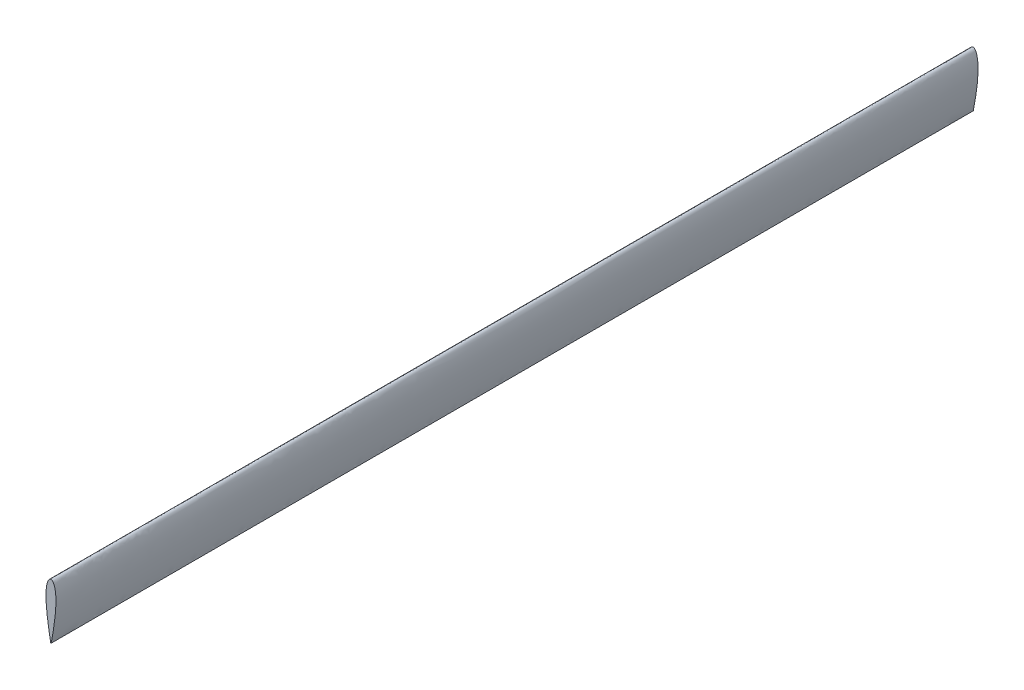
ISO-10303-21;
HEADER;
FILE_DESCRIPTION(('STEP AP214'),'2;1');
FILE_NAME('part.step','',(''),(''),'','','');
FILE_SCHEMA(('AUTOMOTIVE_DESIGN { 1 0 10303 214 1 1 1 1 }'));
ENDSEC;
DATA;
#1=APPLICATION_CONTEXT('core data for automotive mechanical design processes');
#2=APPLICATION_PROTOCOL_DEFINITION('international standard','automotive_design',2000,#1);
#3=PRODUCT_CONTEXT('',#1,'mechanical');
#4=PRODUCT('Part','Part','',(#3));
#5=PRODUCT_RELATED_PRODUCT_CATEGORY('part','',(#4));
#6=PRODUCT_DEFINITION_FORMATION('','',#4);
#7=PRODUCT_DEFINITION_CONTEXT('part definition',#1,'design');
#8=PRODUCT_DEFINITION('design','',#6,#7);
#9=PRODUCT_DEFINITION_SHAPE('','',#8);
#10=(LENGTH_UNIT() NAMED_UNIT(*) SI_UNIT(.MILLI.,.METRE.));
#11=(NAMED_UNIT(*) PLANE_ANGLE_UNIT() SI_UNIT($,.RADIAN.));
#12=(NAMED_UNIT(*) SI_UNIT($,.STERADIAN.) SOLID_ANGLE_UNIT());
#13=UNCERTAINTY_MEASURE_WITH_UNIT(LENGTH_MEASURE(1.E-05),#10,'distance_accuracy_value','');
#14=(GEOMETRIC_REPRESENTATION_CONTEXT(3) GLOBAL_UNCERTAINTY_ASSIGNED_CONTEXT((#13)) GLOBAL_UNIT_ASSIGNED_CONTEXT((#10,
#11,#12)) REPRESENTATION_CONTEXT('',''));
#15=CARTESIAN_POINT('',(0.,0.,0.));
#16=DIRECTION('',(0.,0.,1.));
#17=DIRECTION('',(1.,0.,0.));
#18=AXIS2_PLACEMENT_3D('',#15,#16,#17);
#19=CARTESIAN_POINT('',(-67.4875948517575,-64.5353199929207,500.));
#20=CARTESIAN_POINT('',(-67.7913401335257,-64.5353199924537,500.));
#21=CARTESIAN_POINT('',(-68.3959590638923,-64.8534442465416,500.));
#22=CARTESIAN_POINT('',(-68.9508504087496,-65.6908851901135,500.));
#23=CARTESIAN_POINT('',(-69.4058058106419,-66.7768010889075,500.));
#24=CARTESIAN_POINT('',(-69.7610601050504,-68.1643576571227,500.));
#25=CARTESIAN_POINT('',(-70.0166462813643,-69.8246972827324,500.));
#26=CARTESIAN_POINT('',(-70.1631606961197,-71.7202966596855,500.));
#27=CARTESIAN_POINT('',(-70.1985244608073,-73.8055787115878,500.));
#28=CARTESIAN_POINT('',(-70.1328091092104,-76.0297354682546,500.));
#29=CARTESIAN_POINT('',(-69.9786088417882,-78.3384638931205,500.));
#30=CARTESIAN_POINT('',(-69.7555180676215,-80.67535013921,500.));
#31=CARTESIAN_POINT('',(-69.4825776714293,-82.9831954272819,500.));
#32=CARTESIAN_POINT('',(-69.1801203259965,-85.2052312074084,500.));
#33=CARTESIAN_POINT('',(-68.8646216730773,-87.2877298405176,500.));
#34=CARTESIAN_POINT('',(-68.5501470662488,-89.1754220646044,500.));
#35=CARTESIAN_POINT('',(-68.2669138523294,-90.8352939267604,500.));
#36=CARTESIAN_POINT('',(-67.9857382943077,-92.1866330612374,500.));
#37=CARTESIAN_POINT('',(-67.8344656475918,-93.3019540823841,500.));
#38=CARTESIAN_POINT('',(-67.5667925256463,-93.9084000357001,500.));
#39=CARTESIAN_POINT('',(-67.6647805929366,-94.4852670665843,500.));
#40=CARTESIAN_POINT('',(-67.3104078582983,-94.4852677320834,500.));
#41=CARTESIAN_POINT('',(-67.408454431838,-93.9083903516476,500.));
#42=CARTESIAN_POINT('',(-67.1401902805008,-93.3020411982596,500.));
#43=CARTESIAN_POINT('',(-66.992796390824,-92.1860882095502,500.));
#44=CARTESIAN_POINT('',(-66.6905040117802,-90.8381458734179,500.));
#45=CARTESIAN_POINT('',(-66.5103263391537,-89.1612818905882,500.));
#46=CARTESIAN_POINT('',(-66.0523240559354,-87.2970608255184,500.));
#47=CARTESIAN_POINT('',(-65.946486905602,-85.1840526893623,500.));
#48=CARTESIAN_POINT('',(-65.4495105880155,-82.9906611684524,500.));
#49=CARTESIAN_POINT('',(-65.2315561965908,-80.6735608608053,500.));
#50=CARTESIAN_POINT('',(-64.9934301778194,-78.3389382439019,500.));
#51=CARTESIAN_POINT('',(-64.8431854166046,-76.0296142983408,500.));
#52=CARTESIAN_POINT('',(-64.7764674101248,-73.8056084962441,500.));
#53=CARTESIAN_POINT('',(-64.8120756660437,-71.7202896349983,500.));
#54=CARTESIAN_POINT('',(-64.9585329179068,-69.8246988641866,500.));
#55=CARTESIAN_POINT('',(-65.2141318380491,-68.1643573199626,500.));
#56=CARTESIAN_POINT('',(-65.5693834455864,-66.7768011561874,500.));
#57=CARTESIAN_POINT('',(-66.0243393781533,-65.690885177718,500.));
#58=CARTESIAN_POINT('',(-66.5792306180997,-64.8534442493416,500.));
#59=CARTESIAN_POINT('',(-67.1838495699839,-64.5353199933878,500.));
#60=CARTESIAN_POINT('',(-67.4875948517575,-64.5353199929207,500.));
#61=B_SPLINE_CURVE_WITH_KNOTS('',3,(#19,#20,#21,#22,#23,#24,#25,#26,#27,#28,#29,#30,#31,#32,#33,
#34,#35,#36,#37,#38,#39,#40,#41,#42,#43,#44,#45,#46,#47,#48,#49,#50,#51,#52,#53,#54,#55,#56,#57,
#58,#59,#60),.UNSPECIFIED.,.T.,.F.,(4,1,1,1,1,1,1,1,1,1,1,1,1,1,1,1,1,1,1,1,1,1,1,1,1,1,1,1,1,1,
1,1,1,1,1,1,1,1,1,4),(0.,0.0148086182017369,0.029477235019192,0.0482263545479257,
0.0712801299397421,0.0984042349789458,0.129148048090653,0.162903353778195,0.198940155927656,
0.236430123061365,0.274475786691061,0.312143718610114,0.348497571744518,0.38263195008991,
0.413688920929307,0.440887576679614,0.463541539146755,0.48106581718318,0.493013516153424,
0.499065386583345,0.500894221436263,0.506946091866184,0.518893790836485,0.536418068872882,
0.559072031339997,0.586272735336263,0.617337469967529,0.651455834386372,0.687856281389712,
0.725524213308781,0.763569876938464,0.801059844072182,0.837096646221639,0.870851951909178,
0.901595765020885,0.928719870060112,0.951773645451928,0.970522764980719,0.985191381798002,1.),.UNSPECIFIED.);
#62=DIRECTION('',(0.,0.,-1.));
#63=VECTOR('',#62,1.);
#64=SURFACE_OF_LINEAR_EXTRUSION('',#61,#63);
#65=CARTESIAN_POINT('',(-67.4875948517575,-64.5353199929207,500.));
#66=VERTEX_POINT('',#65);
#67=EDGE_CURVE('E10',#66,#66,#61,.T.);
#68=ORIENTED_EDGE('',*,*,#67,.F.);
#69=EDGE_LOOP('',(#68));
#70=FACE_BOUND('',#69,.T.);
#71=CARTESIAN_POINT('',(-67.4875948517575,-64.5353199929207,0.));
#72=CARTESIAN_POINT('',(-67.7913401335257,-64.5353199924537,0.));
#73=CARTESIAN_POINT('',(-68.3959590638923,-64.8534442465416,0.));
#74=CARTESIAN_POINT('',(-68.9508504087496,-65.6908851901135,0.));
#75=CARTESIAN_POINT('',(-69.4058058106419,-66.7768010889075,0.));
#76=CARTESIAN_POINT('',(-69.7610601050504,-68.1643576571227,0.));
#77=CARTESIAN_POINT('',(-70.0166462813643,-69.8246972827324,0.));
#78=CARTESIAN_POINT('',(-70.1631606961197,-71.7202966596855,0.));
#79=CARTESIAN_POINT('',(-70.1985244608073,-73.8055787115878,0.));
#80=CARTESIAN_POINT('',(-70.1328091092104,-76.0297354682546,0.));
#81=CARTESIAN_POINT('',(-69.9786088417882,-78.3384638931205,0.));
#82=CARTESIAN_POINT('',(-69.7555180676215,-80.67535013921,0.));
#83=CARTESIAN_POINT('',(-69.4825776714293,-82.9831954272819,0.));
#84=CARTESIAN_POINT('',(-69.1801203259965,-85.2052312074084,0.));
#85=CARTESIAN_POINT('',(-68.8646216730773,-87.2877298405176,0.));
#86=CARTESIAN_POINT('',(-68.5501470662488,-89.1754220646044,0.));
#87=CARTESIAN_POINT('',(-68.2669138523294,-90.8352939267604,0.));
#88=CARTESIAN_POINT('',(-67.9857382943077,-92.1866330612374,0.));
#89=CARTESIAN_POINT('',(-67.8344656475918,-93.3019540823841,0.));
#90=CARTESIAN_POINT('',(-67.5667925256463,-93.9084000357001,0.));
#91=CARTESIAN_POINT('',(-67.6647805929366,-94.4852670665843,0.));
#92=CARTESIAN_POINT('',(-67.3104078582983,-94.4852677320834,0.));
#93=CARTESIAN_POINT('',(-67.408454431838,-93.9083903516476,0.));
#94=CARTESIAN_POINT('',(-67.1401902805008,-93.3020411982596,0.));
#95=CARTESIAN_POINT('',(-66.992796390824,-92.1860882095502,0.));
#96=CARTESIAN_POINT('',(-66.6905040117802,-90.8381458734179,0.));
#97=CARTESIAN_POINT('',(-66.5103263391537,-89.1612818905882,0.));
#98=CARTESIAN_POINT('',(-66.0523240559354,-87.2970608255184,0.));
#99=CARTESIAN_POINT('',(-65.946486905602,-85.1840526893623,0.));
#100=CARTESIAN_POINT('',(-65.4495105880155,-82.9906611684524,0.));
#101=CARTESIAN_POINT('',(-65.2315561965908,-80.6735608608053,0.));
#102=CARTESIAN_POINT('',(-64.9934301778194,-78.3389382439019,0.));
#103=CARTESIAN_POINT('',(-64.8431854166046,-76.0296142983408,0.));
#104=CARTESIAN_POINT('',(-64.7764674101248,-73.8056084962441,0.));
#105=CARTESIAN_POINT('',(-64.8120756660437,-71.7202896349983,0.));
#106=CARTESIAN_POINT('',(-64.9585329179068,-69.8246988641866,0.));
#107=CARTESIAN_POINT('',(-65.2141318380491,-68.1643573199626,0.));
#108=CARTESIAN_POINT('',(-65.5693834455864,-66.7768011561874,0.));
#109=CARTESIAN_POINT('',(-66.0243393781533,-65.690885177718,0.));
#110=CARTESIAN_POINT('',(-66.5792306180997,-64.8534442493416,0.));
#111=CARTESIAN_POINT('',(-67.1838495699839,-64.5353199933878,0.));
#112=CARTESIAN_POINT('',(-67.4875948517575,-64.5353199929207,0.));
#113=B_SPLINE_CURVE_WITH_KNOTS('',3,(#71,#72,#73,#74,#75,#76,#77,#78,#79,#80,#81,#82,#83,#84,
#85,#86,#87,#88,#89,#90,#91,#92,#93,#94,#95,#96,#97,#98,#99,#100,#101,#102,#103,#104,#105,#106,
#107,#108,#109,#110,#111,#112),.UNSPECIFIED.,.T.,.F.,(4,1,1,1,1,1,1,1,1,1,1,1,1,1,1,1,1,1,1,1,1,
1,1,1,1,1,1,1,1,1,1,1,1,1,1,1,1,1,1,4),(0.,0.0148086182017369,0.029477235019192,
0.0482263545479257,0.0712801299397421,0.0984042349789458,0.129148048090653,0.162903353778195,
0.198940155927656,0.236430123061365,0.274475786691061,0.312143718610114,0.348497571744518,
0.38263195008991,0.413688920929307,0.440887576679614,0.463541539146755,0.48106581718318,
0.493013516153424,0.499065386583345,0.500894221436263,0.506946091866184,0.518893790836485,
0.536418068872882,0.559072031339997,0.586272735336263,0.617337469967529,0.651455834386372,
0.687856281389712,0.725524213308781,0.763569876938464,0.801059844072182,0.837096646221639,
0.870851951909178,0.901595765020885,0.928719870060112,0.951773645451928,0.970522764980719,
0.985191381798002,1.),.UNSPECIFIED.);
#114=CARTESIAN_POINT('',(-67.4875948517575,-64.5353199929207,0.));
#115=VERTEX_POINT('',#114);
#116=EDGE_CURVE('E41',#115,#115,#113,.T.);
#117=ORIENTED_EDGE('',*,*,#116,.T.);
#118=EDGE_LOOP('',(#117));
#119=FACE_BOUND('',#118,.T.);
#120=ADVANCED_FACE('F37',(#70,#119),#64,.F.);
#121=CARTESIAN_POINT('',(-67.4862669354793,-94.4821760311601,500.));
#122=DIRECTION('',(0.,0.,-1.));
#123=DIRECTION('',(-1.,0.,0.));
#124=AXIS2_PLACEMENT_3D('',#121,#122,#123);
#125=PLANE('',#124);
#126=ORIENTED_EDGE('',*,*,#67,.T.);
#127=EDGE_LOOP('',(#126));
#128=FACE_BOUND('',#127,.T.);
#129=ADVANCED_FACE('F62',(#128),#125,.F.);
#130=CARTESIAN_POINT('',(-67.4862669354793,-94.4821760311601,0.));
#131=DIRECTION('',(0.,0.,-1.));
#132=DIRECTION('',(-1.,0.,0.));
#133=AXIS2_PLACEMENT_3D('',#130,#131,#132);
#134=PLANE('',#133);
#135=ORIENTED_EDGE('',*,*,#116,.F.);
#136=EDGE_LOOP('',(#135));
#137=FACE_BOUND('',#136,.T.);
#138=ADVANCED_FACE('F60',(#137),#134,.T.);
#139=CLOSED_SHELL('',(#120,#129,#138));
#140=MANIFOLD_SOLID_BREP('B2',#139);
#141=ADVANCED_BREP_SHAPE_REPRESENTATION('',(#18,#140),#14);
#142=SHAPE_DEFINITION_REPRESENTATION(#9,#141);
ENDSEC;
END-ISO-10303-21;
